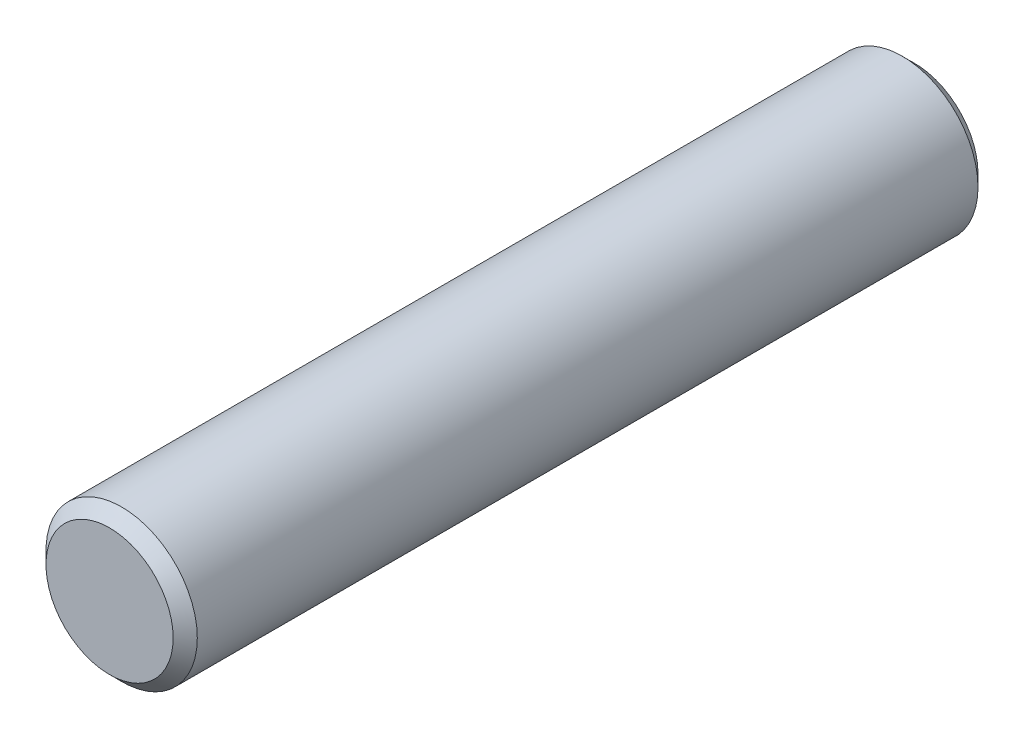
ISO-10303-21;
HEADER;
FILE_DESCRIPTION(('STEP AP214'),'2;1');
FILE_NAME('part.step','',(''),(''),'','','');
FILE_SCHEMA(('AUTOMOTIVE_DESIGN { 1 0 10303 214 1 1 1 1 }'));
ENDSEC;
DATA;
#1=APPLICATION_CONTEXT('core data for automotive mechanical design processes');
#2=APPLICATION_PROTOCOL_DEFINITION('international standard','automotive_design',2000,#1);
#3=PRODUCT_CONTEXT('',#1,'mechanical');
#4=PRODUCT('Part','Part','',(#3));
#5=PRODUCT_RELATED_PRODUCT_CATEGORY('part','',(#4));
#6=PRODUCT_DEFINITION_FORMATION('','',#4);
#7=PRODUCT_DEFINITION_CONTEXT('part definition',#1,'design');
#8=PRODUCT_DEFINITION('design','',#6,#7);
#9=PRODUCT_DEFINITION_SHAPE('','',#8);
#10=(LENGTH_UNIT() NAMED_UNIT(*) SI_UNIT(.MILLI.,.METRE.));
#11=(NAMED_UNIT(*) PLANE_ANGLE_UNIT() SI_UNIT($,.RADIAN.));
#12=(NAMED_UNIT(*) SI_UNIT($,.STERADIAN.) SOLID_ANGLE_UNIT());
#13=UNCERTAINTY_MEASURE_WITH_UNIT(LENGTH_MEASURE(1.E-05),#10,'distance_accuracy_value','');
#14=(GEOMETRIC_REPRESENTATION_CONTEXT(3) GLOBAL_UNCERTAINTY_ASSIGNED_CONTEXT((#13)) GLOBAL_UNIT_ASSIGNED_CONTEXT((#10,
#11,#12)) REPRESENTATION_CONTEXT('',''));
#15=CARTESIAN_POINT('',(0.,0.,0.));
#16=DIRECTION('',(0.,0.,1.));
#17=DIRECTION('',(1.,0.,0.));
#18=AXIS2_PLACEMENT_3D('',#15,#16,#17);
#19=CARTESIAN_POINT('',(0.,0.,12.7));
#20=DIRECTION('',(0.,0.,-1.));
#21=DIRECTION('',(-1.,0.,0.));
#22=AXIS2_PLACEMENT_3D('',#19,#20,#21);
#23=CYLINDRICAL_SURFACE('',#22,2.3876);
#24=CARTESIAN_POINT('',(0.,0.,-12.319));
#25=DIRECTION('',(0.,0.,1.));
#26=DIRECTION('',(1.,0.,0.));
#27=AXIS2_PLACEMENT_3D('',#24,#25,#26);
#28=CIRCLE('',#27,2.3876);
#29=CARTESIAN_POINT('',(2.3876,0.,-12.319));
#30=VERTEX_POINT('',#29);
#31=EDGE_CURVE('E54',#30,#30,#28,.T.);
#32=ORIENTED_EDGE('',*,*,#31,.T.);
#33=EDGE_LOOP('',(#32));
#34=FACE_BOUND('',#33,.T.);
#35=CARTESIAN_POINT('',(0.,0.,12.319));
#36=DIRECTION('',(0.,0.,1.));
#37=DIRECTION('',(1.,0.,0.));
#38=AXIS2_PLACEMENT_3D('',#35,#36,#37);
#39=CIRCLE('',#38,2.3876);
#40=CARTESIAN_POINT('',(2.3876,0.,12.319));
#41=VERTEX_POINT('',#40);
#42=EDGE_CURVE('E58',#41,#41,#39,.F.);
#43=ORIENTED_EDGE('',*,*,#42,.T.);
#44=EDGE_LOOP('',(#43));
#45=FACE_BOUND('',#44,.T.);
#46=ADVANCED_FACE('F43',(#34,#45),#23,.T.);
#47=CARTESIAN_POINT('',(0.,0.,12.7));
#48=DIRECTION('',(0.,0.,1.));
#49=DIRECTION('',(1.,0.,0.));
#50=AXIS2_PLACEMENT_3D('',#47,#48,#49);
#51=PLANE('',#50);
#52=CARTESIAN_POINT('',(0.,0.,12.7));
#53=DIRECTION('',(0.,0.,1.));
#54=DIRECTION('',(1.,0.,0.));
#55=AXIS2_PLACEMENT_3D('',#52,#53,#54);
#56=CIRCLE('',#55,2.00660000000001);
#57=CARTESIAN_POINT('',(2.00660000000001,0.,12.7));
#58=VERTEX_POINT('',#57);
#59=EDGE_CURVE('E12',#58,#58,#56,.T.);
#60=ORIENTED_EDGE('',*,*,#59,.T.);
#61=EDGE_LOOP('',(#60));
#62=FACE_BOUND('',#61,.T.);
#63=ADVANCED_FACE('F74',(#62),#51,.T.);
#64=CARTESIAN_POINT('',(0.,0.,-12.7));
#65=DIRECTION('',(0.,0.,1.));
#66=DIRECTION('',(1.,0.,0.));
#67=AXIS2_PLACEMENT_3D('',#64,#65,#66);
#68=PLANE('',#67);
#69=CARTESIAN_POINT('',(0.,0.,-12.7));
#70=DIRECTION('',(0.,0.,1.));
#71=DIRECTION('',(1.,0.,0.));
#72=AXIS2_PLACEMENT_3D('',#69,#70,#71);
#73=CIRCLE('',#72,2.0066);
#74=CARTESIAN_POINT('',(2.0066,0.,-12.7));
#75=VERTEX_POINT('',#74);
#76=EDGE_CURVE('E50',#75,#75,#73,.F.);
#77=ORIENTED_EDGE('',*,*,#76,.T.);
#78=EDGE_LOOP('',(#77));
#79=FACE_BOUND('',#78,.T.);
#80=ADVANCED_FACE('F71',(#79),#68,.F.);
#81=CARTESIAN_POINT('',(0.,0.,-12.319));
#82=DIRECTION('',(0.,0.,1.));
#83=DIRECTION('',(1.,0.,0.));
#84=AXIS2_PLACEMENT_3D('',#81,#82,#83);
#85=CONICAL_SURFACE('',#84,2.3876,0.785398163397453);
#86=ORIENTED_EDGE('',*,*,#76,.F.);
#87=EDGE_LOOP('',(#86));
#88=FACE_BOUND('',#87,.T.);
#89=ORIENTED_EDGE('',*,*,#31,.F.);
#90=EDGE_LOOP('',(#89));
#91=FACE_BOUND('',#90,.T.);
#92=ADVANCED_FACE('F67',(#88,#91),#85,.T.);
#93=CARTESIAN_POINT('',(0.,0.,12.7));
#94=DIRECTION('',(0.,0.,-1.));
#95=DIRECTION('',(-1.,0.,0.));
#96=AXIS2_PLACEMENT_3D('',#93,#94,#95);
#97=CONICAL_SURFACE('',#96,2.00660000000001,0.785398163397448);
#98=ORIENTED_EDGE('',*,*,#42,.F.);
#99=EDGE_LOOP('',(#98));
#100=FACE_BOUND('',#99,.T.);
#101=ORIENTED_EDGE('',*,*,#59,.F.);
#102=EDGE_LOOP('',(#101));
#103=FACE_BOUND('',#102,.T.);
#104=ADVANCED_FACE('F45',(#100,#103),#97,.T.);
#105=CLOSED_SHELL('',(#46,#63,#80,#92,#104));
#106=MANIFOLD_SOLID_BREP('B2',#105);
#107=ADVANCED_BREP_SHAPE_REPRESENTATION('',(#18,#106),#14);
#108=SHAPE_DEFINITION_REPRESENTATION(#9,#107);
ENDSEC;
END-ISO-10303-21;
